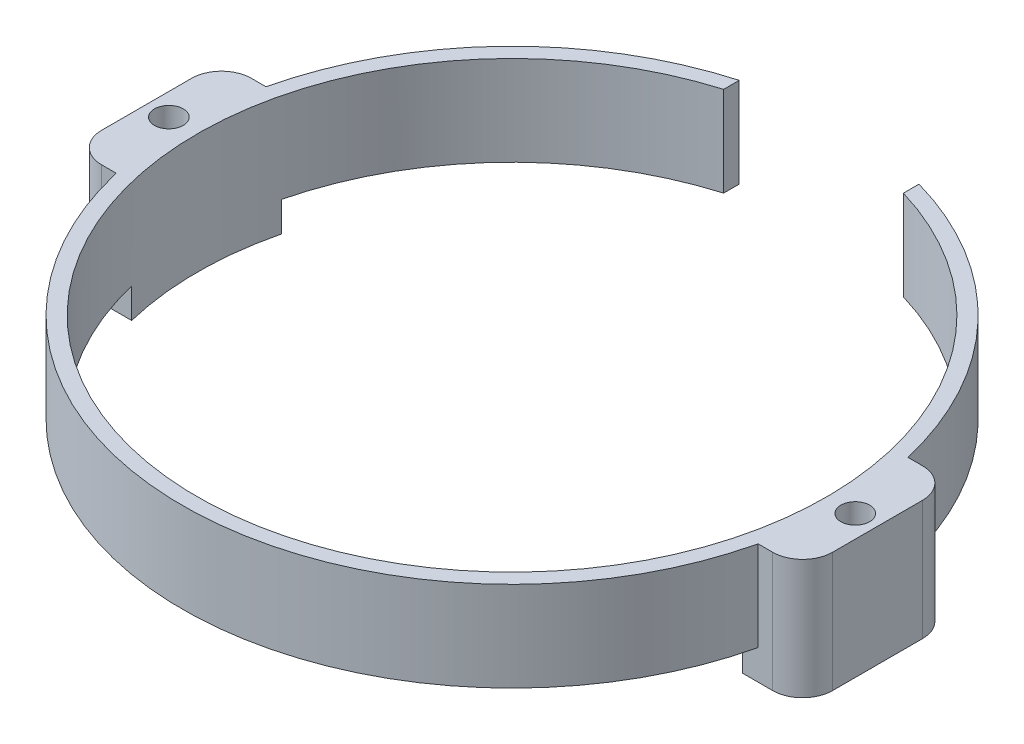
ISO-10303-21;
HEADER;
FILE_DESCRIPTION(('STEP AP214'),'2;1');
FILE_NAME('part.step','',(''),(''),'','','');
FILE_SCHEMA(('AUTOMOTIVE_DESIGN { 1 0 10303 214 1 1 1 1 }'));
ENDSEC;
DATA;
#1=APPLICATION_CONTEXT('core data for automotive mechanical design processes');
#2=APPLICATION_PROTOCOL_DEFINITION('international standard','automotive_design',2000,#1);
#3=PRODUCT_CONTEXT('',#1,'mechanical');
#4=PRODUCT('Part','Part','',(#3));
#5=PRODUCT_RELATED_PRODUCT_CATEGORY('part','',(#4));
#6=PRODUCT_DEFINITION_FORMATION('','',#4);
#7=PRODUCT_DEFINITION_CONTEXT('part definition',#1,'design');
#8=PRODUCT_DEFINITION('design','',#6,#7);
#9=PRODUCT_DEFINITION_SHAPE('','',#8);
#10=(LENGTH_UNIT() NAMED_UNIT(*) SI_UNIT(.MILLI.,.METRE.));
#11=(NAMED_UNIT(*) PLANE_ANGLE_UNIT() SI_UNIT($,.RADIAN.));
#12=(NAMED_UNIT(*) SI_UNIT($,.STERADIAN.) SOLID_ANGLE_UNIT());
#13=UNCERTAINTY_MEASURE_WITH_UNIT(LENGTH_MEASURE(1.E-05),#10,'distance_accuracy_value','');
#14=(GEOMETRIC_REPRESENTATION_CONTEXT(3) GLOBAL_UNCERTAINTY_ASSIGNED_CONTEXT((#13)) GLOBAL_UNIT_ASSIGNED_CONTEXT((#10,
#11,#12)) REPRESENTATION_CONTEXT('',''));
#15=CARTESIAN_POINT('',(0.,0.,0.));
#16=DIRECTION('',(0.,0.,1.));
#17=DIRECTION('',(1.,0.,0.));
#18=AXIS2_PLACEMENT_3D('',#15,#16,#17);
#19=CARTESIAN_POINT('',(0.,-5.,0.));
#20=DIRECTION('',(0.,1.,0.));
#21=DIRECTION('',(0.,0.,1.));
#22=AXIS2_PLACEMENT_3D('',#19,#20,#21);
#23=CYLINDRICAL_SURFACE('',#22,55.);
#24=DIRECTION('',(0.,1.,0.));
#25=VECTOR('',#24,1.);
#26=CARTESIAN_POINT('',(53.5607132140714,-5.,12.5));
#27=LINE('',#26,#25);
#28=CARTESIAN_POINT('',(53.5607132140714,10.,12.5));
#29=VERTEX_POINT('',#28);
#30=CARTESIAN_POINT('',(53.5607132140714,-5.,12.5));
#31=VERTEX_POINT('',#30);
#32=EDGE_CURVE('E298',#29,#31,#27,.F.);
#33=ORIENTED_EDGE('',*,*,#32,.F.);
#34=CARTESIAN_POINT('',(0.,10.,0.));
#35=DIRECTION('',(0.,1.,0.));
#36=DIRECTION('',(0.,0.,1.));
#37=AXIS2_PLACEMENT_3D('',#34,#35,#36);
#38=CIRCLE('',#37,55.);
#39=CARTESIAN_POINT('',(-53.5607132140714,10.,12.5));
#40=VERTEX_POINT('',#39);
#41=EDGE_CURVE('E330',#40,#29,#38,.T.);
#42=ORIENTED_EDGE('',*,*,#41,.F.);
#43=DIRECTION('',(0.,1.,0.));
#44=VECTOR('',#43,1.);
#45=CARTESIAN_POINT('',(-53.5607132140714,-5.,12.5));
#46=LINE('',#45,#44);
#47=CARTESIAN_POINT('',(-53.5607132140714,-5.,12.5));
#48=VERTEX_POINT('',#47);
#49=EDGE_CURVE('E276',#48,#40,#46,.T.);
#50=ORIENTED_EDGE('',*,*,#49,.F.);
#51=CARTESIAN_POINT('',(0.,-5.,0.));
#52=DIRECTION('',(0.,1.,0.));
#53=DIRECTION('',(0.,0.,1.));
#54=AXIS2_PLACEMENT_3D('',#51,#52,#53);
#55=CIRCLE('',#54,55.);
#56=EDGE_CURVE('E342',#48,#31,#55,.T.);
#57=ORIENTED_EDGE('',*,*,#56,.T.);
#58=EDGE_LOOP('',(#33,#42,#50,#57));
#59=FACE_BOUND('',#58,.T.);
#60=ADVANCED_FACE('F49',(#59),#23,.T.);
#61=DIRECTION('',(0.,1.,0.));
#62=VECTOR('',#61,1.);
#63=CARTESIAN_POINT('',(-53.5607132140714,-5.,-12.5));
#64=LINE('',#63,#62);
#65=CARTESIAN_POINT('',(-53.5607132140714,10.,-12.5));
#66=VERTEX_POINT('',#65);
#67=CARTESIAN_POINT('',(-53.5607132140714,-5.,-12.5));
#68=VERTEX_POINT('',#67);
#69=EDGE_CURVE('E284',#66,#68,#64,.F.);
#70=ORIENTED_EDGE('',*,*,#69,.F.);
#71=CARTESIAN_POINT('',(-15.,10.,-52.9150262212918));
#72=VERTEX_POINT('',#71);
#73=EDGE_CURVE('E326',#72,#66,#38,.T.);
#74=ORIENTED_EDGE('',*,*,#73,.F.);
#75=DIRECTION('',(0.,1.,0.));
#76=VECTOR('',#75,1.);
#77=CARTESIAN_POINT('',(-15.,-5.,-52.9150262212918));
#78=LINE('',#77,#76);
#79=CARTESIAN_POINT('',(-15.,-5.,-52.9150262212918));
#80=VERTEX_POINT('',#79);
#81=EDGE_CURVE('E310',#72,#80,#78,.F.);
#82=ORIENTED_EDGE('',*,*,#81,.T.);
#83=EDGE_CURVE('E337',#80,#68,#55,.T.);
#84=ORIENTED_EDGE('',*,*,#83,.T.);
#85=EDGE_LOOP('',(#70,#74,#82,#84));
#86=FACE_BOUND('',#85,.T.);
#87=ADVANCED_FACE('F453',(#86),#23,.T.);
#88=CARTESIAN_POINT('',(0.,-5.,0.));
#89=DIRECTION('',(0.,1.,0.));
#90=DIRECTION('',(0.,0.,1.));
#91=AXIS2_PLACEMENT_3D('',#88,#89,#90);
#92=PLANE('',#91);
#93=CARTESIAN_POINT('',(0.,-5.,0.));
#94=DIRECTION('',(0.,1.,0.));
#95=DIRECTION('',(0.,0.,1.));
#96=AXIS2_PLACEMENT_3D('',#93,#94,#95);
#97=CIRCLE('',#96,52.5);
#98=CARTESIAN_POINT('',(-50.9901951359279,-5.,12.5));
#99=VERTEX_POINT('',#98);
#100=CARTESIAN_POINT('',(50.9901951359278,-5.,12.5));
#101=VERTEX_POINT('',#100);
#102=EDGE_CURVE('E336',#99,#101,#97,.T.);
#103=ORIENTED_EDGE('',*,*,#102,.T.);
#104=DIRECTION('',(1.,0.,0.));
#105=VECTOR('',#104,1.);
#106=CARTESIAN_POINT('',(0.,-5.,12.5));
#107=LINE('',#106,#105);
#108=EDGE_CURVE('E294',#101,#31,#107,.T.);
#109=ORIENTED_EDGE('',*,*,#108,.T.);
#110=ORIENTED_EDGE('',*,*,#56,.F.);
#111=DIRECTION('',(1.,0.,0.));
#112=VECTOR('',#111,1.);
#113=CARTESIAN_POINT('',(0.,-5.,12.5));
#114=LINE('',#113,#112);
#115=EDGE_CURVE('E240',#48,#99,#114,.T.);
#116=ORIENTED_EDGE('',*,*,#115,.T.);
#117=EDGE_LOOP('',(#103,#109,#110,#116));
#118=FACE_BOUND('',#117,.T.);
#119=ADVANCED_FACE('F436',(#118),#92,.F.);
#120=CARTESIAN_POINT('',(-15.,-5.,-50.3115294937453));
#121=VERTEX_POINT('',#120);
#122=CARTESIAN_POINT('',(-50.9901951359278,-5.,-12.5));
#123=VERTEX_POINT('',#122);
#124=EDGE_CURVE('E331',#121,#123,#97,.T.);
#125=ORIENTED_EDGE('',*,*,#124,.T.);
#126=DIRECTION('',(-1.,0.,0.));
#127=VECTOR('',#126,1.);
#128=CARTESIAN_POINT('',(0.,-5.,-12.5));
#129=LINE('',#128,#127);
#130=EDGE_CURVE('E280',#123,#68,#129,.T.);
#131=ORIENTED_EDGE('',*,*,#130,.T.);
#132=ORIENTED_EDGE('',*,*,#83,.F.);
#133=DIRECTION('',(0.,0.,-1.));
#134=VECTOR('',#133,1.);
#135=CARTESIAN_POINT('',(-15.,-5.,0.));
#136=LINE('',#135,#134);
#137=EDGE_CURVE('E305',#121,#80,#136,.T.);
#138=ORIENTED_EDGE('',*,*,#137,.F.);
#139=EDGE_LOOP('',(#125,#131,#132,#138));
#140=FACE_BOUND('',#139,.T.);
#141=ADVANCED_FACE('F458',(#140),#92,.F.);
#142=DIRECTION('',(0.,1.,0.));
#143=VECTOR('',#142,1.);
#144=CARTESIAN_POINT('',(53.5607132140714,-5.,-12.5));
#145=LINE('',#144,#143);
#146=CARTESIAN_POINT('',(53.5607132140714,-5.,-12.5));
#147=VERTEX_POINT('',#146);
#148=CARTESIAN_POINT('',(53.5607132140714,10.,-12.5));
#149=VERTEX_POINT('',#148);
#150=EDGE_CURVE('E290',#147,#149,#145,.T.);
#151=ORIENTED_EDGE('',*,*,#150,.F.);
#152=CARTESIAN_POINT('',(15.,-5.,-52.9150262212918));
#153=VERTEX_POINT('',#152);
#154=EDGE_CURVE('E335',#147,#153,#55,.T.);
#155=ORIENTED_EDGE('',*,*,#154,.T.);
#156=DIRECTION('',(0.,1.,0.));
#157=VECTOR('',#156,1.);
#158=CARTESIAN_POINT('',(15.,-5.,-52.9150262212918));
#159=LINE('',#158,#157);
#160=CARTESIAN_POINT('',(15.,10.,-52.9150262212918));
#161=VERTEX_POINT('',#160);
#162=EDGE_CURVE('E318',#153,#161,#159,.T.);
#163=ORIENTED_EDGE('',*,*,#162,.T.);
#164=EDGE_CURVE('E325',#149,#161,#38,.T.);
#165=ORIENTED_EDGE('',*,*,#164,.F.);
#166=EDGE_LOOP('',(#151,#155,#163,#165));
#167=FACE_BOUND('',#166,.T.);
#168=ADVANCED_FACE('F426',(#167),#23,.T.);
#169=ORIENTED_EDGE('',*,*,#154,.F.);
#170=DIRECTION('',(-1.,0.,0.));
#171=VECTOR('',#170,1.);
#172=CARTESIAN_POINT('',(0.,-5.,-12.5));
#173=LINE('',#172,#171);
#174=CARTESIAN_POINT('',(50.9901951359279,-5.,-12.5));
#175=VERTEX_POINT('',#174);
#176=EDGE_CURVE('E287',#147,#175,#173,.T.);
#177=ORIENTED_EDGE('',*,*,#176,.T.);
#178=CARTESIAN_POINT('',(15.,-5.,-50.3115294937453));
#179=VERTEX_POINT('',#178);
#180=EDGE_CURVE('E211',#175,#179,#97,.T.);
#181=ORIENTED_EDGE('',*,*,#180,.T.);
#182=DIRECTION('',(0.,0.,1.));
#183=VECTOR('',#182,1.);
#184=CARTESIAN_POINT('',(15.,-5.,-70.));
#185=LINE('',#184,#183);
#186=EDGE_CURVE('E301',#153,#179,#185,.T.);
#187=ORIENTED_EDGE('',*,*,#186,.F.);
#188=EDGE_LOOP('',(#169,#177,#181,#187));
#189=FACE_BOUND('',#188,.T.);
#190=ADVANCED_FACE('F446',(#189),#92,.F.);
#191=CARTESIAN_POINT('',(0.,-5.,0.));
#192=DIRECTION('',(0.,1.,0.));
#193=DIRECTION('',(0.,0.,1.));
#194=AXIS2_PLACEMENT_3D('',#191,#192,#193);
#195=CYLINDRICAL_SURFACE('',#194,52.5);
#196=ORIENTED_EDGE('',*,*,#180,.F.);
#197=DIRECTION('',(0.,1.,0.));
#198=VECTOR('',#197,1.);
#199=CARTESIAN_POINT('',(50.9901951359278,-10.,-12.5));
#200=LINE('',#199,#198);
#201=CARTESIAN_POINT('',(50.9901951359278,-10.,-12.5));
#202=VERTEX_POINT('',#201);
#203=EDGE_CURVE('E193',#202,#175,#200,.T.);
#204=ORIENTED_EDGE('',*,*,#203,.F.);
#205=CARTESIAN_POINT('',(0.,-10.,0.));
#206=DIRECTION('',(0.,-1.,0.));
#207=DIRECTION('',(0.,0.,1.));
#208=AXIS2_PLACEMENT_3D('',#205,#206,#207);
#209=CIRCLE('',#208,52.5);
#210=CARTESIAN_POINT('',(50.9901951359278,-10.,12.5));
#211=VERTEX_POINT('',#210);
#212=EDGE_CURVE('E201',#202,#211,#209,.T.);
#213=ORIENTED_EDGE('',*,*,#212,.T.);
#214=DIRECTION('',(0.,1.,0.));
#215=VECTOR('',#214,1.);
#216=CARTESIAN_POINT('',(50.9901951359278,-10.,12.5));
#217=LINE('',#216,#215);
#218=EDGE_CURVE('E213',#211,#101,#217,.T.);
#219=ORIENTED_EDGE('',*,*,#218,.T.);
#220=ORIENTED_EDGE('',*,*,#102,.F.);
#221=DIRECTION('',(0.,1.,0.));
#222=VECTOR('',#221,1.);
#223=CARTESIAN_POINT('',(-50.9901951359278,-10.,12.5));
#224=LINE('',#223,#222);
#225=CARTESIAN_POINT('',(-50.9901951359278,-10.,12.5));
#226=VERTEX_POINT('',#225);
#227=EDGE_CURVE('E242',#226,#99,#224,.T.);
#228=ORIENTED_EDGE('',*,*,#227,.F.);
#229=CARTESIAN_POINT('',(0.,-10.,0.));
#230=DIRECTION('',(0.,-1.,0.));
#231=DIRECTION('',(0.,0.,1.));
#232=AXIS2_PLACEMENT_3D('',#229,#230,#231);
#233=CIRCLE('',#232,52.5);
#234=CARTESIAN_POINT('',(-50.9901951359278,-10.,-12.5));
#235=VERTEX_POINT('',#234);
#236=EDGE_CURVE('E264',#226,#235,#233,.T.);
#237=ORIENTED_EDGE('',*,*,#236,.T.);
#238=DIRECTION('',(0.,1.,0.));
#239=VECTOR('',#238,1.);
#240=CARTESIAN_POINT('',(-50.9901951359278,-10.,-12.5));
#241=LINE('',#240,#239);
#242=EDGE_CURVE('E246',#235,#123,#241,.T.);
#243=ORIENTED_EDGE('',*,*,#242,.T.);
#244=ORIENTED_EDGE('',*,*,#124,.F.);
#245=DIRECTION('',(0.,1.,0.));
#246=VECTOR('',#245,1.);
#247=CARTESIAN_POINT('',(-15.,-5.,-50.3115294937453));
#248=LINE('',#247,#246);
#249=CARTESIAN_POINT('',(-15.,10.,-50.3115294937453));
#250=VERTEX_POINT('',#249);
#251=EDGE_CURVE('E307',#250,#121,#248,.F.);
#252=ORIENTED_EDGE('',*,*,#251,.F.);
#253=CARTESIAN_POINT('',(0.,10.,0.));
#254=DIRECTION('',(0.,1.,0.));
#255=DIRECTION('',(0.,0.,1.));
#256=AXIS2_PLACEMENT_3D('',#253,#254,#255);
#257=CIRCLE('',#256,52.5);
#258=CARTESIAN_POINT('',(15.,10.,-50.3115294937453));
#259=VERTEX_POINT('',#258);
#260=EDGE_CURVE('E322',#250,#259,#257,.T.);
#261=ORIENTED_EDGE('',*,*,#260,.T.);
#262=DIRECTION('',(0.,1.,0.));
#263=VECTOR('',#262,1.);
#264=CARTESIAN_POINT('',(15.,-5.,-50.3115294937453));
#265=LINE('',#264,#263);
#266=EDGE_CURVE('E314',#179,#259,#265,.T.);
#267=ORIENTED_EDGE('',*,*,#266,.F.);
#268=EDGE_LOOP('',(#196,#204,#213,#219,#220,#228,#237,#243,#244,#252,#261,#267));
#269=FACE_BOUND('',#268,.T.);
#270=ADVANCED_FACE('F207',(#269),#195,.F.);
#271=CARTESIAN_POINT('',(0.,10.,0.));
#272=DIRECTION('',(0.,1.,0.));
#273=DIRECTION('',(0.,0.,1.));
#274=AXIS2_PLACEMENT_3D('',#271,#272,#273);
#275=PLANE('',#274);
#276=CARTESIAN_POINT('',(-57.2754541749996,10.,0.));
#277=DIRECTION('',(0.,1.,0.));
#278=DIRECTION('',(0.,0.,1.));
#279=AXIS2_PLACEMENT_3D('',#276,#277,#278);
#280=CIRCLE('',#279,2.4);
#281=CARTESIAN_POINT('',(-57.2754541749996,10.,2.4));
#282=VERTEX_POINT('',#281);
#283=EDGE_CURVE('E525',#282,#282,#280,.T.);
#284=ORIENTED_EDGE('',*,*,#283,.F.);
#285=EDGE_LOOP('',(#284));
#286=FACE_BOUND('',#285,.T.);
#287=CARTESIAN_POINT('',(57.2754541749996,10.,0.));
#288=DIRECTION('',(0.,1.,0.));
#289=DIRECTION('',(0.,0.,1.));
#290=AXIS2_PLACEMENT_3D('',#287,#288,#289);
#291=CIRCLE('',#290,2.4);
#292=CARTESIAN_POINT('',(57.2754541749996,10.,2.4));
#293=VERTEX_POINT('',#292);
#294=EDGE_CURVE('E527',#293,#293,#291,.T.);
#295=ORIENTED_EDGE('',*,*,#294,.F.);
#296=EDGE_LOOP('',(#295));
#297=FACE_BOUND('',#296,.T.);
#298=DIRECTION('',(0.,0.,-1.));
#299=VECTOR('',#298,1.);
#300=CARTESIAN_POINT('',(60.9901951359278,10.,12.5));
#301=LINE('',#300,#299);
#302=CARTESIAN_POINT('',(60.9901951359278,10.,7.5));
#303=VERTEX_POINT('',#302);
#304=CARTESIAN_POINT('',(60.9901951359278,10.,-7.5));
#305=VERTEX_POINT('',#304);
#306=EDGE_CURVE('E227',#303,#305,#301,.T.);
#307=ORIENTED_EDGE('',*,*,#306,.T.);
#308=CARTESIAN_POINT('',(55.9901951359278,10.,-7.5));
#309=DIRECTION('',(0.,1.,0.));
#310=DIRECTION('',(0.,0.,1.));
#311=AXIS2_PLACEMENT_3D('',#308,#309,#310);
#312=CIRCLE('',#311,5.);
#313=CARTESIAN_POINT('',(55.9901951359278,10.,-12.5));
#314=VERTEX_POINT('',#313);
#315=EDGE_CURVE('E366',#305,#314,#312,.T.);
#316=ORIENTED_EDGE('',*,*,#315,.T.);
#317=DIRECTION('',(-1.,0.,0.));
#318=VECTOR('',#317,1.);
#319=CARTESIAN_POINT('',(50.9901951359278,10.,-12.5));
#320=LINE('',#319,#318);
#321=EDGE_CURVE('E231',#314,#149,#320,.T.);
#322=ORIENTED_EDGE('',*,*,#321,.T.);
#323=ORIENTED_EDGE('',*,*,#164,.T.);
#324=DIRECTION('',(0.,0.,1.));
#325=VECTOR('',#324,1.);
#326=CARTESIAN_POINT('',(15.,10.,0.));
#327=LINE('',#326,#325);
#328=EDGE_CURVE('E346',#161,#259,#327,.T.);
#329=ORIENTED_EDGE('',*,*,#328,.T.);
#330=ORIENTED_EDGE('',*,*,#260,.F.);
#331=DIRECTION('',(0.,0.,-1.));
#332=VECTOR('',#331,1.);
#333=CARTESIAN_POINT('',(-15.,10.,0.));
#334=LINE('',#333,#332);
#335=EDGE_CURVE('E341',#250,#72,#334,.T.);
#336=ORIENTED_EDGE('',*,*,#335,.T.);
#337=ORIENTED_EDGE('',*,*,#73,.T.);
#338=DIRECTION('',(-1.,0.,0.));
#339=VECTOR('',#338,1.);
#340=CARTESIAN_POINT('',(-60.9901951359278,10.,-12.5));
#341=LINE('',#340,#339);
#342=CARTESIAN_POINT('',(-55.9901951359278,10.,-12.5));
#343=VERTEX_POINT('',#342);
#344=EDGE_CURVE('E251',#66,#343,#341,.T.);
#345=ORIENTED_EDGE('',*,*,#344,.T.);
#346=CARTESIAN_POINT('',(-55.9901951359278,10.,-7.5));
#347=DIRECTION('',(0.,1.,0.));
#348=DIRECTION('',(0.,0.,1.));
#349=AXIS2_PLACEMENT_3D('',#346,#347,#348);
#350=CIRCLE('',#349,5.);
#351=CARTESIAN_POINT('',(-60.9901951359278,10.,-7.5));
#352=VERTEX_POINT('',#351);
#353=EDGE_CURVE('E357',#343,#352,#350,.T.);
#354=ORIENTED_EDGE('',*,*,#353,.T.);
#355=DIRECTION('',(0.,0.,1.));
#356=VECTOR('',#355,1.);
#357=CARTESIAN_POINT('',(-60.9901951359278,10.,12.5));
#358=LINE('',#357,#356);
#359=CARTESIAN_POINT('',(-60.9901951359278,10.,7.5));
#360=VERTEX_POINT('',#359);
#361=EDGE_CURVE('E232',#352,#360,#358,.T.);
#362=ORIENTED_EDGE('',*,*,#361,.T.);
#363=CARTESIAN_POINT('',(-55.9901951359278,10.,7.5));
#364=DIRECTION('',(0.,1.,0.));
#365=DIRECTION('',(0.,0.,1.));
#366=AXIS2_PLACEMENT_3D('',#363,#364,#365);
#367=CIRCLE('',#366,5.);
#368=CARTESIAN_POINT('',(-55.9901951359278,10.,12.5));
#369=VERTEX_POINT('',#368);
#370=EDGE_CURVE('E360',#360,#369,#367,.T.);
#371=ORIENTED_EDGE('',*,*,#370,.T.);
#372=DIRECTION('',(1.,0.,0.));
#373=VECTOR('',#372,1.);
#374=CARTESIAN_POINT('',(-60.9901951359278,10.,12.5));
#375=LINE('',#374,#373);
#376=EDGE_CURVE('E255',#369,#40,#375,.T.);
#377=ORIENTED_EDGE('',*,*,#376,.T.);
#378=ORIENTED_EDGE('',*,*,#41,.T.);
#379=DIRECTION('',(1.,0.,0.));
#380=VECTOR('',#379,1.);
#381=CARTESIAN_POINT('',(50.9901951359278,10.,12.5));
#382=LINE('',#381,#380);
#383=CARTESIAN_POINT('',(55.9901951359278,10.,12.5));
#384=VERTEX_POINT('',#383);
#385=EDGE_CURVE('E235',#29,#384,#382,.T.);
#386=ORIENTED_EDGE('',*,*,#385,.T.);
#387=CARTESIAN_POINT('',(55.9901951359278,10.,7.5));
#388=DIRECTION('',(0.,1.,0.));
#389=DIRECTION('',(0.,0.,1.));
#390=AXIS2_PLACEMENT_3D('',#387,#388,#389);
#391=CIRCLE('',#390,5.);
#392=EDGE_CURVE('E363',#384,#303,#391,.T.);
#393=ORIENTED_EDGE('',*,*,#392,.T.);
#394=EDGE_LOOP('',(#307,#316,#322,#323,#329,#330,#336,#337,#345,#354,#362,#371,#377,#378,#386,#393));
#395=FACE_BOUND('',#394,.T.);
#396=ADVANCED_FACE('F404',(#286,#297,#395),#275,.T.);
#397=CARTESIAN_POINT('',(-15.,-5.,0.));
#398=DIRECTION('',(1.,0.,0.));
#399=DIRECTION('',(0.,0.,-1.));
#400=AXIS2_PLACEMENT_3D('',#397,#398,#399);
#401=PLANE('',#400);
#402=ORIENTED_EDGE('',*,*,#335,.F.);
#403=ORIENTED_EDGE('',*,*,#251,.T.);
#404=ORIENTED_EDGE('',*,*,#137,.T.);
#405=ORIENTED_EDGE('',*,*,#81,.F.);
#406=EDGE_LOOP('',(#402,#403,#404,#405));
#407=FACE_BOUND('',#406,.T.);
#408=ADVANCED_FACE('F483',(#407),#401,.T.);
#409=CARTESIAN_POINT('',(15.,-5.,-70.));
#410=DIRECTION('',(-1.,0.,0.));
#411=DIRECTION('',(0.,0.,1.));
#412=AXIS2_PLACEMENT_3D('',#409,#410,#411);
#413=PLANE('',#412);
#414=ORIENTED_EDGE('',*,*,#186,.T.);
#415=ORIENTED_EDGE('',*,*,#266,.T.);
#416=ORIENTED_EDGE('',*,*,#328,.F.);
#417=ORIENTED_EDGE('',*,*,#162,.F.);
#418=EDGE_LOOP('',(#414,#415,#416,#417));
#419=FACE_BOUND('',#418,.T.);
#420=ADVANCED_FACE('F424',(#419),#413,.T.);
#421=CARTESIAN_POINT('',(-60.9901951359278,-10.,12.5));
#422=DIRECTION('',(-1.,0.,0.));
#423=DIRECTION('',(0.,0.,1.));
#424=AXIS2_PLACEMENT_3D('',#421,#422,#423);
#425=PLANE('',#424);
#426=DIRECTION('',(0.,0.,1.));
#427=VECTOR('',#426,1.);
#428=CARTESIAN_POINT('',(-60.9901951359278,-10.,12.5));
#429=LINE('',#428,#427);
#430=CARTESIAN_POINT('',(-60.9901951359278,-10.,-7.5));
#431=VERTEX_POINT('',#430);
#432=CARTESIAN_POINT('',(-60.9901951359278,-10.,7.5));
#433=VERTEX_POINT('',#432);
#434=EDGE_CURVE('E256',#431,#433,#429,.T.);
#435=ORIENTED_EDGE('',*,*,#434,.T.);
#436=DIRECTION('',(0.,1.,0.));
#437=VECTOR('',#436,1.);
#438=CARTESIAN_POINT('',(-60.9901951359278,-10.,7.5));
#439=LINE('',#438,#437);
#440=EDGE_CURVE('E384',#433,#360,#439,.T.);
#441=ORIENTED_EDGE('',*,*,#440,.T.);
#442=ORIENTED_EDGE('',*,*,#361,.F.);
#443=DIRECTION('',(0.,1.,0.));
#444=VECTOR('',#443,1.);
#445=CARTESIAN_POINT('',(-60.9901951359278,-10.,-7.5));
#446=LINE('',#445,#444);
#447=EDGE_CURVE('E381',#352,#431,#446,.F.);
#448=ORIENTED_EDGE('',*,*,#447,.T.);
#449=EDGE_LOOP('',(#435,#441,#442,#448));
#450=FACE_BOUND('',#449,.T.);
#451=ADVANCED_FACE('F399',(#450),#425,.T.);
#452=CARTESIAN_POINT('',(-60.9901951359278,-10.,-12.5));
#453=DIRECTION('',(0.,0.,-1.));
#454=DIRECTION('',(-1.,0.,0.));
#455=AXIS2_PLACEMENT_3D('',#452,#453,#454);
#456=PLANE('',#455);
#457=DIRECTION('',(-1.,0.,0.));
#458=VECTOR('',#457,1.);
#459=CARTESIAN_POINT('',(-60.9901951359278,-10.,-12.5));
#460=LINE('',#459,#458);
#461=CARTESIAN_POINT('',(-55.9901951359278,-10.,-12.5));
#462=VERTEX_POINT('',#461);
#463=EDGE_CURVE('E245',#235,#462,#460,.T.);
#464=ORIENTED_EDGE('',*,*,#463,.T.);
#465=DIRECTION('',(0.,1.,0.));
#466=VECTOR('',#465,1.);
#467=CARTESIAN_POINT('',(-55.9901951359278,-10.,-12.5));
#468=LINE('',#467,#466);
#469=EDGE_CURVE('E11',#462,#343,#468,.T.);
#470=ORIENTED_EDGE('',*,*,#469,.T.);
#471=ORIENTED_EDGE('',*,*,#344,.F.);
#472=ORIENTED_EDGE('',*,*,#69,.T.);
#473=ORIENTED_EDGE('',*,*,#130,.F.);
#474=ORIENTED_EDGE('',*,*,#242,.F.);
#475=EDGE_LOOP('',(#464,#470,#471,#472,#473,#474));
#476=FACE_BOUND('',#475,.T.);
#477=ADVANCED_FACE('F456',(#476),#456,.T.);
#478=CARTESIAN_POINT('',(-60.9901951359278,-10.,12.5));
#479=DIRECTION('',(0.,0.,1.));
#480=DIRECTION('',(1.,0.,0.));
#481=AXIS2_PLACEMENT_3D('',#478,#479,#480);
#482=PLANE('',#481);
#483=ORIENTED_EDGE('',*,*,#376,.F.);
#484=DIRECTION('',(0.,1.,0.));
#485=VECTOR('',#484,1.);
#486=CARTESIAN_POINT('',(-55.9901951359278,-10.,12.5));
#487=LINE('',#486,#485);
#488=CARTESIAN_POINT('',(-55.9901951359278,-10.,12.5));
#489=VERTEX_POINT('',#488);
#490=EDGE_CURVE('E73',#369,#489,#487,.F.);
#491=ORIENTED_EDGE('',*,*,#490,.T.);
#492=DIRECTION('',(1.,0.,0.));
#493=VECTOR('',#492,1.);
#494=CARTESIAN_POINT('',(-60.9901951359278,-10.,12.5));
#495=LINE('',#494,#493);
#496=EDGE_CURVE('E267',#489,#226,#495,.T.);
#497=ORIENTED_EDGE('',*,*,#496,.T.);
#498=ORIENTED_EDGE('',*,*,#227,.T.);
#499=ORIENTED_EDGE('',*,*,#115,.F.);
#500=ORIENTED_EDGE('',*,*,#49,.T.);
#501=EDGE_LOOP('',(#483,#491,#497,#498,#499,#500));
#502=FACE_BOUND('',#501,.T.);
#503=ADVANCED_FACE('F406',(#502),#482,.T.);
#504=CARTESIAN_POINT('',(0.,-10.,0.));
#505=DIRECTION('',(0.,1.,0.));
#506=DIRECTION('',(0.,0.,1.));
#507=AXIS2_PLACEMENT_3D('',#504,#505,#506);
#508=PLANE('',#507);
#509=CARTESIAN_POINT('',(-57.2754541749996,-10.,0.));
#510=DIRECTION('',(0.,1.,0.));
#511=DIRECTION('',(0.,0.,1.));
#512=AXIS2_PLACEMENT_3D('',#509,#510,#511);
#513=CIRCLE('',#512,2.4);
#514=CARTESIAN_POINT('',(-57.2754541749996,-10.,2.4));
#515=VERTEX_POINT('',#514);
#516=EDGE_CURVE('E250',#515,#515,#513,.T.);
#517=ORIENTED_EDGE('',*,*,#516,.T.);
#518=EDGE_LOOP('',(#517));
#519=FACE_BOUND('',#518,.T.);
#520=ORIENTED_EDGE('',*,*,#496,.F.);
#521=CARTESIAN_POINT('',(-55.9901951359278,-10.,7.5));
#522=DIRECTION('',(0.,1.,0.));
#523=DIRECTION('',(0.,0.,1.));
#524=AXIS2_PLACEMENT_3D('',#521,#522,#523);
#525=CIRCLE('',#524,5.);
#526=EDGE_CURVE('E58',#489,#433,#525,.F.);
#527=ORIENTED_EDGE('',*,*,#526,.T.);
#528=ORIENTED_EDGE('',*,*,#434,.F.);
#529=CARTESIAN_POINT('',(-55.9901951359278,-10.,-7.5));
#530=DIRECTION('',(0.,1.,0.));
#531=DIRECTION('',(0.,0.,1.));
#532=AXIS2_PLACEMENT_3D('',#529,#530,#531);
#533=CIRCLE('',#532,5.);
#534=EDGE_CURVE('E65',#431,#462,#533,.F.);
#535=ORIENTED_EDGE('',*,*,#534,.T.);
#536=ORIENTED_EDGE('',*,*,#463,.F.);
#537=ORIENTED_EDGE('',*,*,#236,.F.);
#538=EDGE_LOOP('',(#520,#527,#528,#535,#536,#537));
#539=FACE_BOUND('',#538,.T.);
#540=ADVANCED_FACE('F394',(#519,#539),#508,.F.);
#541=CARTESIAN_POINT('',(60.9901951359278,-10.,12.5));
#542=DIRECTION('',(1.,0.,0.));
#543=DIRECTION('',(0.,0.,-1.));
#544=AXIS2_PLACEMENT_3D('',#541,#542,#543);
#545=PLANE('',#544);
#546=DIRECTION('',(0.,0.,-1.));
#547=VECTOR('',#546,1.);
#548=CARTESIAN_POINT('',(60.9901951359278,-10.,12.5));
#549=LINE('',#548,#547);
#550=CARTESIAN_POINT('',(60.9901951359278,-10.,7.5));
#551=VERTEX_POINT('',#550);
#552=CARTESIAN_POINT('',(60.9901951359278,-10.,-7.5));
#553=VERTEX_POINT('',#552);
#554=EDGE_CURVE('E202',#551,#553,#549,.T.);
#555=ORIENTED_EDGE('',*,*,#554,.T.);
#556=DIRECTION('',(0.,1.,0.));
#557=VECTOR('',#556,1.);
#558=CARTESIAN_POINT('',(60.9901951359278,-10.,-7.5));
#559=LINE('',#558,#557);
#560=EDGE_CURVE('E353',#553,#305,#559,.T.);
#561=ORIENTED_EDGE('',*,*,#560,.T.);
#562=ORIENTED_EDGE('',*,*,#306,.F.);
#563=DIRECTION('',(0.,1.,0.));
#564=VECTOR('',#563,1.);
#565=CARTESIAN_POINT('',(60.9901951359278,-10.,7.5));
#566=LINE('',#565,#564);
#567=EDGE_CURVE('E350',#303,#551,#566,.F.);
#568=ORIENTED_EDGE('',*,*,#567,.T.);
#569=EDGE_LOOP('',(#555,#561,#562,#568));
#570=FACE_BOUND('',#569,.T.);
#571=ADVANCED_FACE('F491',(#570),#545,.T.);
#572=CARTESIAN_POINT('',(50.9901951359278,-10.,12.5));
#573=DIRECTION('',(0.,0.,1.));
#574=DIRECTION('',(1.,0.,0.));
#575=AXIS2_PLACEMENT_3D('',#572,#573,#574);
#576=PLANE('',#575);
#577=DIRECTION('',(1.,0.,0.));
#578=VECTOR('',#577,1.);
#579=CARTESIAN_POINT('',(50.9901951359278,-10.,12.5));
#580=LINE('',#579,#578);
#581=CARTESIAN_POINT('',(55.9901951359278,-10.,12.5));
#582=VERTEX_POINT('',#581);
#583=EDGE_CURVE('E214',#211,#582,#580,.T.);
#584=ORIENTED_EDGE('',*,*,#583,.T.);
#585=DIRECTION('',(0.,1.,0.));
#586=VECTOR('',#585,1.);
#587=CARTESIAN_POINT('',(55.9901951359278,-10.,12.5));
#588=LINE('',#587,#586);
#589=EDGE_CURVE('E377',#582,#384,#588,.T.);
#590=ORIENTED_EDGE('',*,*,#589,.T.);
#591=ORIENTED_EDGE('',*,*,#385,.F.);
#592=ORIENTED_EDGE('',*,*,#32,.T.);
#593=ORIENTED_EDGE('',*,*,#108,.F.);
#594=ORIENTED_EDGE('',*,*,#218,.F.);
#595=EDGE_LOOP('',(#584,#590,#591,#592,#593,#594));
#596=FACE_BOUND('',#595,.T.);
#597=ADVANCED_FACE('F439',(#596),#576,.T.);
#598=CARTESIAN_POINT('',(50.9901951359278,-10.,-12.5));
#599=DIRECTION('',(0.,0.,-1.));
#600=DIRECTION('',(-1.,0.,0.));
#601=AXIS2_PLACEMENT_3D('',#598,#599,#600);
#602=PLANE('',#601);
#603=ORIENTED_EDGE('',*,*,#321,.F.);
#604=DIRECTION('',(0.,1.,0.));
#605=VECTOR('',#604,1.);
#606=CARTESIAN_POINT('',(55.9901951359278,-10.,-12.5));
#607=LINE('',#606,#605);
#608=CARTESIAN_POINT('',(55.9901951359278,-10.,-12.5));
#609=VERTEX_POINT('',#608);
#610=EDGE_CURVE('E196',#314,#609,#607,.F.);
#611=ORIENTED_EDGE('',*,*,#610,.T.);
#612=DIRECTION('',(-1.,0.,0.));
#613=VECTOR('',#612,1.);
#614=CARTESIAN_POINT('',(50.9901951359278,-10.,-12.5));
#615=LINE('',#614,#613);
#616=EDGE_CURVE('E189',#609,#202,#615,.T.);
#617=ORIENTED_EDGE('',*,*,#616,.T.);
#618=ORIENTED_EDGE('',*,*,#203,.T.);
#619=ORIENTED_EDGE('',*,*,#176,.F.);
#620=ORIENTED_EDGE('',*,*,#150,.T.);
#621=EDGE_LOOP('',(#603,#611,#617,#618,#619,#620));
#622=FACE_BOUND('',#621,.T.);
#623=ADVANCED_FACE('F192',(#622),#602,.T.);
#624=CARTESIAN_POINT('',(0.,-10.,0.));
#625=DIRECTION('',(0.,1.,0.));
#626=DIRECTION('',(0.,0.,1.));
#627=AXIS2_PLACEMENT_3D('',#624,#625,#626);
#628=PLANE('',#627);
#629=CARTESIAN_POINT('',(57.2754541749996,-10.,0.));
#630=DIRECTION('',(0.,1.,0.));
#631=DIRECTION('',(0.,0.,1.));
#632=AXIS2_PLACEMENT_3D('',#629,#630,#631);
#633=CIRCLE('',#632,2.4);
#634=CARTESIAN_POINT('',(57.2754541749996,-10.,2.4));
#635=VERTEX_POINT('',#634);
#636=EDGE_CURVE('E534',#635,#635,#633,.T.);
#637=ORIENTED_EDGE('',*,*,#636,.T.);
#638=EDGE_LOOP('',(#637));
#639=FACE_BOUND('',#638,.T.);
#640=ORIENTED_EDGE('',*,*,#616,.F.);
#641=CARTESIAN_POINT('',(55.9901951359278,-10.,-7.5));
#642=DIRECTION('',(0.,1.,0.));
#643=DIRECTION('',(0.,0.,1.));
#644=AXIS2_PLACEMENT_3D('',#641,#642,#643);
#645=CIRCLE('',#644,5.);
#646=EDGE_CURVE('E374',#609,#553,#645,.F.);
#647=ORIENTED_EDGE('',*,*,#646,.T.);
#648=ORIENTED_EDGE('',*,*,#554,.F.);
#649=CARTESIAN_POINT('',(55.9901951359278,-10.,7.5));
#650=DIRECTION('',(0.,1.,0.));
#651=DIRECTION('',(0.,0.,1.));
#652=AXIS2_PLACEMENT_3D('',#649,#650,#651);
#653=CIRCLE('',#652,5.);
#654=EDGE_CURVE('E371',#551,#582,#653,.F.);
#655=ORIENTED_EDGE('',*,*,#654,.T.);
#656=ORIENTED_EDGE('',*,*,#583,.F.);
#657=ORIENTED_EDGE('',*,*,#212,.F.);
#658=EDGE_LOOP('',(#640,#647,#648,#655,#656,#657));
#659=FACE_BOUND('',#658,.T.);
#660=ADVANCED_FACE('F216',(#639,#659),#628,.F.);
#661=CARTESIAN_POINT('',(57.2754541749996,-10.,0.));
#662=DIRECTION('',(0.,1.,0.));
#663=DIRECTION('',(0.,0.,1.));
#664=AXIS2_PLACEMENT_3D('',#661,#662,#663);
#665=CYLINDRICAL_SURFACE('',#664,2.4);
#666=ORIENTED_EDGE('',*,*,#636,.F.);
#667=EDGE_LOOP('',(#666));
#668=FACE_BOUND('',#667,.T.);
#669=ORIENTED_EDGE('',*,*,#294,.T.);
#670=EDGE_LOOP('',(#669));
#671=FACE_BOUND('',#670,.T.);
#672=ADVANCED_FACE('F508',(#668,#671),#665,.F.);
#673=CARTESIAN_POINT('',(-57.2754541749996,-10.,0.));
#674=DIRECTION('',(0.,1.,0.));
#675=DIRECTION('',(0.,0.,1.));
#676=AXIS2_PLACEMENT_3D('',#673,#674,#675);
#677=CYLINDRICAL_SURFACE('',#676,2.4);
#678=ORIENTED_EDGE('',*,*,#516,.F.);
#679=EDGE_LOOP('',(#678));
#680=FACE_BOUND('',#679,.T.);
#681=ORIENTED_EDGE('',*,*,#283,.T.);
#682=EDGE_LOOP('',(#681));
#683=FACE_BOUND('',#682,.T.);
#684=ADVANCED_FACE('F512',(#680,#683),#677,.F.);
#685=CARTESIAN_POINT('',(55.9901951359278,-10.,-7.5));
#686=DIRECTION('',(0.,1.,0.));
#687=DIRECTION('',(0.,0.,1.));
#688=AXIS2_PLACEMENT_3D('',#685,#686,#687);
#689=CYLINDRICAL_SURFACE('',#688,5.);
#690=ORIENTED_EDGE('',*,*,#646,.F.);
#691=ORIENTED_EDGE('',*,*,#610,.F.);
#692=ORIENTED_EDGE('',*,*,#315,.F.);
#693=ORIENTED_EDGE('',*,*,#560,.F.);
#694=EDGE_LOOP('',(#690,#691,#692,#693));
#695=FACE_BOUND('',#694,.T.);
#696=ADVANCED_FACE('F515',(#695),#689,.T.);
#697=CARTESIAN_POINT('',(55.9901951359278,-10.,7.5));
#698=DIRECTION('',(0.,1.,0.));
#699=DIRECTION('',(0.,0.,1.));
#700=AXIS2_PLACEMENT_3D('',#697,#698,#699);
#701=CYLINDRICAL_SURFACE('',#700,5.);
#702=ORIENTED_EDGE('',*,*,#654,.F.);
#703=ORIENTED_EDGE('',*,*,#567,.F.);
#704=ORIENTED_EDGE('',*,*,#392,.F.);
#705=ORIENTED_EDGE('',*,*,#589,.F.);
#706=EDGE_LOOP('',(#702,#703,#704,#705));
#707=FACE_BOUND('',#706,.T.);
#708=ADVANCED_FACE('F465',(#707),#701,.T.);
#709=CARTESIAN_POINT('',(-55.9901951359278,-10.,7.5));
#710=DIRECTION('',(0.,1.,0.));
#711=DIRECTION('',(0.,0.,1.));
#712=AXIS2_PLACEMENT_3D('',#709,#710,#711);
#713=CYLINDRICAL_SURFACE('',#712,5.);
#714=ORIENTED_EDGE('',*,*,#526,.F.);
#715=ORIENTED_EDGE('',*,*,#490,.F.);
#716=ORIENTED_EDGE('',*,*,#370,.F.);
#717=ORIENTED_EDGE('',*,*,#440,.F.);
#718=EDGE_LOOP('',(#714,#715,#716,#717));
#719=FACE_BOUND('',#718,.T.);
#720=ADVANCED_FACE('F402',(#719),#713,.T.);
#721=CARTESIAN_POINT('',(-55.9901951359278,-10.,-7.5));
#722=DIRECTION('',(0.,1.,0.));
#723=DIRECTION('',(0.,0.,1.));
#724=AXIS2_PLACEMENT_3D('',#721,#722,#723);
#725=CYLINDRICAL_SURFACE('',#724,5.);
#726=ORIENTED_EDGE('',*,*,#534,.F.);
#727=ORIENTED_EDGE('',*,*,#447,.F.);
#728=ORIENTED_EDGE('',*,*,#353,.F.);
#729=ORIENTED_EDGE('',*,*,#469,.F.);
#730=EDGE_LOOP('',(#726,#727,#728,#729));
#731=FACE_BOUND('',#730,.T.);
#732=ADVANCED_FACE('F51',(#731),#725,.T.);
#733=CLOSED_SHELL('',(#60,#87,#119,#141,#168,#190,#270,#396,#408,#420,#451,#477,#503,#540,#571,
#597,#623,#660,#672,#684,#696,#708,#720,#732));
#734=MANIFOLD_SOLID_BREP('B2',#733);
#735=ADVANCED_BREP_SHAPE_REPRESENTATION('',(#18,#734),#14);
#736=SHAPE_DEFINITION_REPRESENTATION(#9,#735);
ENDSEC;
END-ISO-10303-21;
